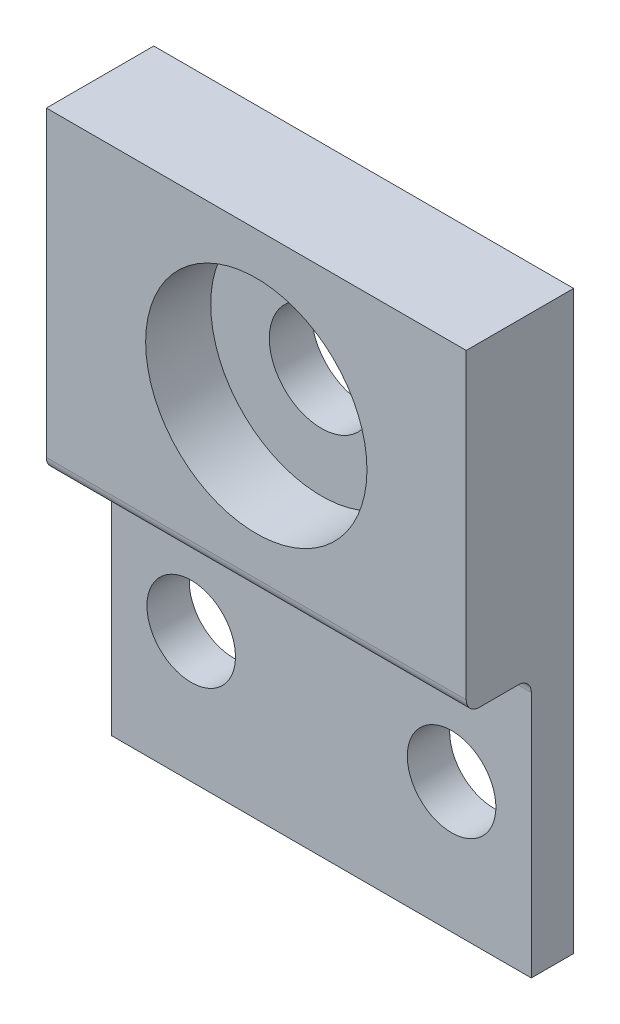
ISO-10303-21;
HEADER;
FILE_DESCRIPTION(('STEP AP214'),'2;1');
FILE_NAME('part.step','',(''),(''),'','','');
FILE_SCHEMA(('AUTOMOTIVE_DESIGN { 1 0 10303 214 1 1 1 1 }'));
ENDSEC;
DATA;
#1=APPLICATION_CONTEXT('core data for automotive mechanical design processes');
#2=APPLICATION_PROTOCOL_DEFINITION('international standard','automotive_design',2000,#1);
#3=PRODUCT_CONTEXT('',#1,'mechanical');
#4=PRODUCT('Part','Part','',(#3));
#5=PRODUCT_RELATED_PRODUCT_CATEGORY('part','',(#4));
#6=PRODUCT_DEFINITION_FORMATION('','',#4);
#7=PRODUCT_DEFINITION_CONTEXT('part definition',#1,'design');
#8=PRODUCT_DEFINITION('design','',#6,#7);
#9=PRODUCT_DEFINITION_SHAPE('','',#8);
#10=(LENGTH_UNIT() NAMED_UNIT(*) SI_UNIT(.MILLI.,.METRE.));
#11=(NAMED_UNIT(*) PLANE_ANGLE_UNIT() SI_UNIT($,.RADIAN.));
#12=(NAMED_UNIT(*) SI_UNIT($,.STERADIAN.) SOLID_ANGLE_UNIT());
#13=UNCERTAINTY_MEASURE_WITH_UNIT(LENGTH_MEASURE(1.E-05),#10,'distance_accuracy_value','');
#14=(GEOMETRIC_REPRESENTATION_CONTEXT(3) GLOBAL_UNCERTAINTY_ASSIGNED_CONTEXT((#13)) GLOBAL_UNIT_ASSIGNED_CONTEXT((#10,
#11,#12)) REPRESENTATION_CONTEXT('',''));
#15=CARTESIAN_POINT('',(0.,0.,0.));
#16=DIRECTION('',(0.,0.,1.));
#17=DIRECTION('',(1.,0.,0.));
#18=AXIS2_PLACEMENT_3D('',#15,#16,#17);
#19=CARTESIAN_POINT('',(0.,0.,3.25));
#20=DIRECTION('',(0.,0.,1.));
#21=DIRECTION('',(1.,0.,0.));
#22=AXIS2_PLACEMENT_3D('',#19,#20,#21);
#23=PLANE('',#22);
#24=CARTESIAN_POINT('',(26.125,10.,3.25));
#25=DIRECTION('',(0.,0.,1.));
#26=DIRECTION('',(1.,0.,0.));
#27=AXIS2_PLACEMENT_3D('',#24,#25,#26);
#28=CIRCLE('',#27,3.40036762718386);
#29=CARTESIAN_POINT('',(22.7246323728161,10.,3.25));
#30=VERTEX_POINT('',#29);
#31=EDGE_CURVE('E139',#30,#30,#28,.T.);
#32=ORIENTED_EDGE('',*,*,#31,.F.);
#33=EDGE_LOOP('',(#32));
#34=FACE_BOUND('',#33,.T.);
#35=CARTESIAN_POINT('',(6.125,10.,3.25));
#36=DIRECTION('',(0.,0.,1.));
#37=DIRECTION('',(1.,0.,0.));
#38=AXIS2_PLACEMENT_3D('',#35,#36,#37);
#39=CIRCLE('',#38,3.40036762718386);
#40=CARTESIAN_POINT('',(2.72463237281614,10.,3.25));
#41=VERTEX_POINT('',#40);
#42=EDGE_CURVE('E142',#41,#41,#39,.T.);
#43=ORIENTED_EDGE('',*,*,#42,.F.);
#44=EDGE_LOOP('',(#43));
#45=FACE_BOUND('',#44,.T.);
#46=DIRECTION('',(0.,1.,0.));
#47=VECTOR('',#46,1.);
#48=CARTESIAN_POINT('',(32.25,0.,3.25));
#49=LINE('',#48,#47);
#50=CARTESIAN_POINT('',(32.25,0.,3.25));
#51=VERTEX_POINT('',#50);
#52=CARTESIAN_POINT('',(32.25,19.,3.25));
#53=VERTEX_POINT('',#52);
#54=EDGE_CURVE('E149',#51,#53,#49,.T.);
#55=ORIENTED_EDGE('',*,*,#54,.T.);
#56=DIRECTION('',(-1.,0.,0.));
#57=VECTOR('',#56,1.);
#58=CARTESIAN_POINT('',(0.,19.,3.25));
#59=LINE('',#58,#57);
#60=CARTESIAN_POINT('',(0.,19.,3.25));
#61=VERTEX_POINT('',#60);
#62=EDGE_CURVE('E185',#53,#61,#59,.T.);
#63=ORIENTED_EDGE('',*,*,#62,.T.);
#64=DIRECTION('',(0.,1.,0.));
#65=VECTOR('',#64,1.);
#66=CARTESIAN_POINT('',(0.,0.,3.25));
#67=LINE('',#66,#65);
#68=CARTESIAN_POINT('',(0.,0.,3.25));
#69=VERTEX_POINT('',#68);
#70=EDGE_CURVE('E152',#69,#61,#67,.T.);
#71=ORIENTED_EDGE('',*,*,#70,.F.);
#72=DIRECTION('',(1.,0.,0.));
#73=VECTOR('',#72,1.);
#74=CARTESIAN_POINT('',(0.,0.,3.25));
#75=LINE('',#74,#73);
#76=EDGE_CURVE('E146',#69,#51,#75,.T.);
#77=ORIENTED_EDGE('',*,*,#76,.T.);
#78=EDGE_LOOP('',(#55,#63,#71,#77));
#79=FACE_BOUND('',#78,.T.);
#80=ADVANCED_FACE('F35',(#34,#45,#79),#23,.T.);
#81=CARTESIAN_POINT('',(0.,0.,3.25));
#82=DIRECTION('',(0.,1.,0.));
#83=DIRECTION('',(-1.,0.,0.));
#84=AXIS2_PLACEMENT_3D('',#81,#82,#83);
#85=PLANE('',#84);
#86=DIRECTION('',(1.,0.,0.));
#87=VECTOR('',#86,1.);
#88=CARTESIAN_POINT('',(0.,0.,0.));
#89=LINE('',#88,#87);
#90=CARTESIAN_POINT('',(0.,0.,0.));
#91=VERTEX_POINT('',#90);
#92=CARTESIAN_POINT('',(32.25,0.,0.));
#93=VERTEX_POINT('',#92);
#94=EDGE_CURVE('E163',#91,#93,#89,.T.);
#95=ORIENTED_EDGE('',*,*,#94,.T.);
#96=DIRECTION('',(0.,0.,-1.));
#97=VECTOR('',#96,1.);
#98=CARTESIAN_POINT('',(32.25,0.,3.25));
#99=LINE('',#98,#97);
#100=EDGE_CURVE('E119',#51,#93,#99,.T.);
#101=ORIENTED_EDGE('',*,*,#100,.F.);
#102=ORIENTED_EDGE('',*,*,#76,.F.);
#103=DIRECTION('',(0.,0.,-1.));
#104=VECTOR('',#103,1.);
#105=CARTESIAN_POINT('',(0.,0.,3.25));
#106=LINE('',#105,#104);
#107=EDGE_CURVE('E157',#69,#91,#106,.T.);
#108=ORIENTED_EDGE('',*,*,#107,.T.);
#109=EDGE_LOOP('',(#95,#101,#102,#108));
#110=FACE_BOUND('',#109,.T.);
#111=ADVANCED_FACE('F195',(#110),#85,.F.);
#112=CARTESIAN_POINT('',(32.25,0.,3.25));
#113=DIRECTION('',(-1.,0.,0.));
#114=DIRECTION('',(0.,0.,1.));
#115=AXIS2_PLACEMENT_3D('',#112,#113,#114);
#116=PLANE('',#115);
#117=DIRECTION('',(0.,1.,0.));
#118=VECTOR('',#117,1.);
#119=CARTESIAN_POINT('',(32.25,0.,8.25));
#120=LINE('',#119,#118);
#121=CARTESIAN_POINT('',(32.25,21.,8.25));
#122=VERTEX_POINT('',#121);
#123=CARTESIAN_POINT('',(32.25,44.25,8.25));
#124=VERTEX_POINT('',#123);
#125=EDGE_CURVE('E100',#122,#124,#120,.T.);
#126=ORIENTED_EDGE('',*,*,#125,.F.);
#127=CARTESIAN_POINT('',(32.25,21.,7.25));
#128=DIRECTION('',(-1.,0.,0.));
#129=DIRECTION('',(0.,0.,1.));
#130=AXIS2_PLACEMENT_3D('',#127,#128,#129);
#131=CIRCLE('',#130,1.);
#132=CARTESIAN_POINT('',(32.25,20.,7.25));
#133=VERTEX_POINT('',#132);
#134=EDGE_CURVE('E177',#122,#133,#131,.F.);
#135=ORIENTED_EDGE('',*,*,#134,.T.);
#136=DIRECTION('',(0.,0.,-1.));
#137=VECTOR('',#136,1.);
#138=CARTESIAN_POINT('',(32.25,20.,8.25));
#139=LINE('',#138,#137);
#140=CARTESIAN_POINT('',(32.25,20.,4.25));
#141=VERTEX_POINT('',#140);
#142=EDGE_CURVE('E132',#133,#141,#139,.T.);
#143=ORIENTED_EDGE('',*,*,#142,.T.);
#144=CARTESIAN_POINT('',(32.25,19.,4.25));
#145=DIRECTION('',(-1.,0.,0.));
#146=DIRECTION('',(0.,0.,1.));
#147=AXIS2_PLACEMENT_3D('',#144,#145,#146);
#148=CIRCLE('',#147,1.);
#149=EDGE_CURVE('E11',#141,#53,#148,.T.);
#150=ORIENTED_EDGE('',*,*,#149,.T.);
#151=ORIENTED_EDGE('',*,*,#54,.F.);
#152=ORIENTED_EDGE('',*,*,#100,.T.);
#153=DIRECTION('',(0.,1.,0.));
#154=VECTOR('',#153,1.);
#155=CARTESIAN_POINT('',(32.25,0.,0.));
#156=LINE('',#155,#154);
#157=CARTESIAN_POINT('',(32.25,44.25,0.));
#158=VERTEX_POINT('',#157);
#159=EDGE_CURVE('E115',#93,#158,#156,.T.);
#160=ORIENTED_EDGE('',*,*,#159,.T.);
#161=DIRECTION('',(0.,0.,-1.));
#162=VECTOR('',#161,1.);
#163=CARTESIAN_POINT('',(32.25,44.25,3.25));
#164=LINE('',#163,#162);
#165=EDGE_CURVE('E112',#124,#158,#164,.T.);
#166=ORIENTED_EDGE('',*,*,#165,.F.);
#167=EDGE_LOOP('',(#126,#135,#143,#150,#151,#152,#160,#166));
#168=FACE_BOUND('',#167,.T.);
#169=ADVANCED_FACE('F113',(#168),#116,.F.);
#170=CARTESIAN_POINT('',(0.,44.25,3.25));
#171=DIRECTION('',(0.,1.,0.));
#172=DIRECTION('',(0.,0.,1.));
#173=AXIS2_PLACEMENT_3D('',#170,#171,#172);
#174=PLANE('',#173);
#175=DIRECTION('',(1.,0.,0.));
#176=VECTOR('',#175,1.);
#177=CARTESIAN_POINT('',(0.,44.25,0.));
#178=LINE('',#177,#176);
#179=CARTESIAN_POINT('',(0.,44.25,0.));
#180=VERTEX_POINT('',#179);
#181=EDGE_CURVE('E167',#180,#158,#178,.T.);
#182=ORIENTED_EDGE('',*,*,#181,.F.);
#183=DIRECTION('',(0.,0.,-1.));
#184=VECTOR('',#183,1.);
#185=CARTESIAN_POINT('',(0.,44.25,3.25));
#186=LINE('',#185,#184);
#187=CARTESIAN_POINT('',(0.,44.25,8.25));
#188=VERTEX_POINT('',#187);
#189=EDGE_CURVE('E120',#188,#180,#186,.T.);
#190=ORIENTED_EDGE('',*,*,#189,.F.);
#191=DIRECTION('',(1.,0.,0.));
#192=VECTOR('',#191,1.);
#193=CARTESIAN_POINT('',(0.,44.25,8.25));
#194=LINE('',#193,#192);
#195=EDGE_CURVE('E105',#188,#124,#194,.T.);
#196=ORIENTED_EDGE('',*,*,#195,.T.);
#197=ORIENTED_EDGE('',*,*,#165,.T.);
#198=EDGE_LOOP('',(#182,#190,#196,#197));
#199=FACE_BOUND('',#198,.T.);
#200=ADVANCED_FACE('F123',(#199),#174,.T.);
#201=CARTESIAN_POINT('',(0.,0.,3.25));
#202=DIRECTION('',(-1.,0.,0.));
#203=DIRECTION('',(0.,0.,1.));
#204=AXIS2_PLACEMENT_3D('',#201,#202,#203);
#205=PLANE('',#204);
#206=DIRECTION('',(0.,0.,-1.));
#207=VECTOR('',#206,1.);
#208=CARTESIAN_POINT('',(0.,20.,8.25));
#209=LINE('',#208,#207);
#210=CARTESIAN_POINT('',(0.,20.,7.25));
#211=VERTEX_POINT('',#210);
#212=CARTESIAN_POINT('',(0.,20.,4.25));
#213=VERTEX_POINT('',#212);
#214=EDGE_CURVE('E127',#211,#213,#209,.T.);
#215=ORIENTED_EDGE('',*,*,#214,.F.);
#216=CARTESIAN_POINT('',(0.,21.,7.25));
#217=DIRECTION('',(-1.,0.,0.));
#218=DIRECTION('',(0.,0.,1.));
#219=AXIS2_PLACEMENT_3D('',#216,#217,#218);
#220=CIRCLE('',#219,1.);
#221=CARTESIAN_POINT('',(0.,21.,8.25));
#222=VERTEX_POINT('',#221);
#223=EDGE_CURVE('E183',#211,#222,#220,.T.);
#224=ORIENTED_EDGE('',*,*,#223,.T.);
#225=DIRECTION('',(0.,1.,0.));
#226=VECTOR('',#225,1.);
#227=CARTESIAN_POINT('',(0.,0.,8.25));
#228=LINE('',#227,#226);
#229=EDGE_CURVE('E125',#222,#188,#228,.T.);
#230=ORIENTED_EDGE('',*,*,#229,.T.);
#231=ORIENTED_EDGE('',*,*,#189,.T.);
#232=DIRECTION('',(0.,1.,0.));
#233=VECTOR('',#232,1.);
#234=CARTESIAN_POINT('',(0.,0.,0.));
#235=LINE('',#234,#233);
#236=EDGE_CURVE('E169',#91,#180,#235,.T.);
#237=ORIENTED_EDGE('',*,*,#236,.F.);
#238=ORIENTED_EDGE('',*,*,#107,.F.);
#239=ORIENTED_EDGE('',*,*,#70,.T.);
#240=CARTESIAN_POINT('',(0.,19.,4.25));
#241=DIRECTION('',(-1.,0.,0.));
#242=DIRECTION('',(0.,0.,1.));
#243=AXIS2_PLACEMENT_3D('',#240,#241,#242);
#244=CIRCLE('',#243,1.);
#245=EDGE_CURVE('E43',#61,#213,#244,.F.);
#246=ORIENTED_EDGE('',*,*,#245,.T.);
#247=EDGE_LOOP('',(#215,#224,#230,#231,#237,#238,#239,#246));
#248=FACE_BOUND('',#247,.T.);
#249=ADVANCED_FACE('F189',(#248),#205,.T.);
#250=CARTESIAN_POINT('',(6.125,10.,3.25));
#251=DIRECTION('',(0.,0.,-1.));
#252=DIRECTION('',(-1.,0.,0.));
#253=AXIS2_PLACEMENT_3D('',#250,#251,#252);
#254=CYLINDRICAL_SURFACE('',#253,3.40036762718386);
#255=CARTESIAN_POINT('',(6.125,10.,0.));
#256=DIRECTION('',(0.,0.,1.));
#257=DIRECTION('',(1.,0.,0.));
#258=AXIS2_PLACEMENT_3D('',#255,#256,#257);
#259=CIRCLE('',#258,3.40036762718386);
#260=CARTESIAN_POINT('',(2.72463237281614,10.,0.));
#261=VERTEX_POINT('',#260);
#262=EDGE_CURVE('E160',#261,#261,#259,.T.);
#263=CARTESIAN_POINT('',(2.72463237281614,10.,3.25));
#264=CARTESIAN_POINT('',(2.72463237281614,10.,3.21614583333333));
#265=CARTESIAN_POINT('',(2.72463237281614,10.,3.18229166666667));
#266=CARTESIAN_POINT('',(2.72463237281614,10.,3.11458333333333));
#267=CARTESIAN_POINT('',(2.72463237281614,10.,3.08072916666667));
#268=CARTESIAN_POINT('',(2.72463237281614,10.,3.01302083333333));
#269=CARTESIAN_POINT('',(2.72463237281614,10.,2.97916666666667));
#270=CARTESIAN_POINT('',(2.72463237281614,10.,2.91145833333333));
#271=CARTESIAN_POINT('',(2.72463237281614,10.,2.87760416666667));
#272=CARTESIAN_POINT('',(2.72463237281614,10.,2.80989583333333));
#273=CARTESIAN_POINT('',(2.72463237281614,10.,2.77604166666667));
#274=CARTESIAN_POINT('',(2.72463237281614,10.,2.70833333333333));
#275=CARTESIAN_POINT('',(2.72463237281614,10.,2.67447916666667));
#276=CARTESIAN_POINT('',(2.72463237281614,10.,2.60677083333333));
#277=CARTESIAN_POINT('',(2.72463237281614,10.,2.57291666666667));
#278=CARTESIAN_POINT('',(2.72463237281614,10.,2.50520833333333));
#279=CARTESIAN_POINT('',(2.72463237281614,10.,2.47135416666667));
#280=CARTESIAN_POINT('',(2.72463237281614,10.,2.40364583333333));
#281=CARTESIAN_POINT('',(2.72463237281614,10.,2.36979166666667));
#282=CARTESIAN_POINT('',(2.72463237281614,10.,2.30208333333333));
#283=CARTESIAN_POINT('',(2.72463237281614,10.,2.26822916666667));
#284=CARTESIAN_POINT('',(2.72463237281614,10.,2.20052083333333));
#285=CARTESIAN_POINT('',(2.72463237281614,10.,2.16666666666667));
#286=CARTESIAN_POINT('',(2.72463237281614,10.,2.09895833333333));
#287=CARTESIAN_POINT('',(2.72463237281614,10.,2.06510416666667));
#288=CARTESIAN_POINT('',(2.72463237281614,10.,1.99739583333333));
#289=CARTESIAN_POINT('',(2.72463237281614,10.,1.96354166666667));
#290=CARTESIAN_POINT('',(2.72463237281614,10.,1.89583333333333));
#291=CARTESIAN_POINT('',(2.72463237281614,10.,1.86197916666667));
#292=CARTESIAN_POINT('',(2.72463237281614,10.,1.79427083333333));
#293=CARTESIAN_POINT('',(2.72463237281614,10.,1.76041666666667));
#294=CARTESIAN_POINT('',(2.72463237281614,10.,1.69270833333333));
#295=CARTESIAN_POINT('',(2.72463237281614,10.,1.65885416666667));
#296=CARTESIAN_POINT('',(2.72463237281614,10.,1.59114583333333));
#297=CARTESIAN_POINT('',(2.72463237281614,10.,1.55729166666667));
#298=CARTESIAN_POINT('',(2.72463237281614,10.,1.48958333333333));
#299=CARTESIAN_POINT('',(2.72463237281614,10.,1.45572916666667));
#300=CARTESIAN_POINT('',(2.72463237281614,10.,1.38802083333333));
#301=CARTESIAN_POINT('',(2.72463237281614,10.,1.35416666666667));
#302=CARTESIAN_POINT('',(2.72463237281614,10.,1.28645833333333));
#303=CARTESIAN_POINT('',(2.72463237281614,10.,1.25260416666667));
#304=CARTESIAN_POINT('',(2.72463237281614,10.,1.18489583333333));
#305=CARTESIAN_POINT('',(2.72463237281614,10.,1.15104166666667));
#306=CARTESIAN_POINT('',(2.72463237281614,10.,1.08333333333333));
#307=CARTESIAN_POINT('',(2.72463237281614,10.,1.04947916666667));
#308=CARTESIAN_POINT('',(2.72463237281614,10.,0.981770833333333));
#309=CARTESIAN_POINT('',(2.72463237281614,10.,0.947916666666667));
#310=CARTESIAN_POINT('',(2.72463237281614,10.,0.880208333333333));
#311=CARTESIAN_POINT('',(2.72463237281614,10.,0.846354166666667));
#312=CARTESIAN_POINT('',(2.72463237281614,10.,0.778645833333333));
#313=CARTESIAN_POINT('',(2.72463237281614,10.,0.744791666666667));
#314=CARTESIAN_POINT('',(2.72463237281614,10.,0.677083333333333));
#315=CARTESIAN_POINT('',(2.72463237281614,10.,0.643229166666667));
#316=CARTESIAN_POINT('',(2.72463237281614,10.,0.575520833333333));
#317=CARTESIAN_POINT('',(2.72463237281614,10.,0.541666666666667));
#318=CARTESIAN_POINT('',(2.72463237281614,10.,0.473958333333333));
#319=CARTESIAN_POINT('',(2.72463237281614,10.,0.440104166666667));
#320=CARTESIAN_POINT('',(2.72463237281614,10.,0.372395833333333));
#321=CARTESIAN_POINT('',(2.72463237281614,10.,0.338541666666667));
#322=CARTESIAN_POINT('',(2.72463237281614,10.,0.270833333333333));
#323=CARTESIAN_POINT('',(2.72463237281614,10.,0.236979166666667));
#324=CARTESIAN_POINT('',(2.72463237281614,10.,0.169270833333333));
#325=CARTESIAN_POINT('',(2.72463237281614,10.,0.135416666666667));
#326=CARTESIAN_POINT('',(2.72463237281614,10.,0.0677083333333334));
#327=CARTESIAN_POINT('',(2.72463237281614,10.,0.0338541666666667));
#328=CARTESIAN_POINT('',(2.72463237281614,10.,0.));
#329=B_SPLINE_CURVE_WITH_KNOTS('',3,(#263,#264,#265,#266,#267,#268,#269,#270,#271,#272,#273,
#274,#275,#276,#277,#278,#279,#280,#281,#282,#283,#284,#285,#286,#287,#288,#289,#290,#291,#292,
#293,#294,#295,#296,#297,#298,#299,#300,#301,#302,#303,#304,#305,#306,#307,#308,#309,#310,#311,
#312,#313,#314,#315,#316,#317,#318,#319,#320,#321,#322,#323,#324,#325,#326,#327,#328),
.UNSPECIFIED.,.F.,.F.,(4,2,2,2,2,2,2,2,2,2,2,2,2,2,2,2,2,2,2,2,2,2,2,2,2,2,2,2,2,2,2,2,4),(0.,
0.1015625,0.203125,0.3046875,0.40625,0.5078125,0.609375,0.7109375,0.8125,0.9140625,1.015625,
1.1171875,1.21875,1.3203125,1.421875,1.5234375,1.625,1.7265625,1.828125,1.9296875,2.03125,
2.1328125,2.234375,2.3359375,2.4375,2.5390625,2.640625,2.7421875,2.84375,2.9453125,3.046875,
3.1484375,3.25),.UNSPECIFIED.);
#330=EDGE_CURVE('BSEAM247',#41,#261,#329,.T.);
#331=ORIENTED_EDGE('',*,*,#42,.T.);
#332=ORIENTED_EDGE('',*,*,#262,.F.);
#333=ORIENTED_EDGE('',*,*,#330,.T.);
#334=ORIENTED_EDGE('',*,*,#330,.F.);
#335=EDGE_LOOP('',(#331,#333,#332,#334));
#336=FACE_BOUND('',#335,.T.);
#337=ADVANCED_FACE('F247',(#336),#254,.F.);
#338=CARTESIAN_POINT('',(26.125,10.,3.25));
#339=DIRECTION('',(0.,0.,-1.));
#340=DIRECTION('',(-1.,0.,0.));
#341=AXIS2_PLACEMENT_3D('',#338,#339,#340);
#342=CYLINDRICAL_SURFACE('',#341,3.40036762718386);
#343=CARTESIAN_POINT('',(26.125,10.,0.));
#344=DIRECTION('',(0.,0.,1.));
#345=DIRECTION('',(1.,0.,0.));
#346=AXIS2_PLACEMENT_3D('',#343,#344,#345);
#347=CIRCLE('',#346,3.40036762718386);
#348=CARTESIAN_POINT('',(22.7246323728161,10.,0.));
#349=VERTEX_POINT('',#348);
#350=EDGE_CURVE('E135',#349,#349,#347,.T.);
#351=CARTESIAN_POINT('',(22.7246323728161,10.,3.25));
#352=CARTESIAN_POINT('',(22.7246323728161,10.,3.21614583333333));
#353=CARTESIAN_POINT('',(22.7246323728161,10.,3.18229166666667));
#354=CARTESIAN_POINT('',(22.7246323728161,10.,3.11458333333333));
#355=CARTESIAN_POINT('',(22.7246323728161,10.,3.08072916666667));
#356=CARTESIAN_POINT('',(22.7246323728161,10.,3.01302083333333));
#357=CARTESIAN_POINT('',(22.7246323728161,10.,2.97916666666667));
#358=CARTESIAN_POINT('',(22.7246323728161,10.,2.91145833333333));
#359=CARTESIAN_POINT('',(22.7246323728161,10.,2.87760416666667));
#360=CARTESIAN_POINT('',(22.7246323728161,10.,2.80989583333333));
#361=CARTESIAN_POINT('',(22.7246323728161,10.,2.77604166666667));
#362=CARTESIAN_POINT('',(22.7246323728161,10.,2.70833333333333));
#363=CARTESIAN_POINT('',(22.7246323728161,10.,2.67447916666667));
#364=CARTESIAN_POINT('',(22.7246323728161,10.,2.60677083333333));
#365=CARTESIAN_POINT('',(22.7246323728161,10.,2.57291666666667));
#366=CARTESIAN_POINT('',(22.7246323728161,10.,2.50520833333333));
#367=CARTESIAN_POINT('',(22.7246323728161,10.,2.47135416666667));
#368=CARTESIAN_POINT('',(22.7246323728161,10.,2.40364583333333));
#369=CARTESIAN_POINT('',(22.7246323728161,10.,2.36979166666667));
#370=CARTESIAN_POINT('',(22.7246323728161,10.,2.30208333333333));
#371=CARTESIAN_POINT('',(22.7246323728161,10.,2.26822916666667));
#372=CARTESIAN_POINT('',(22.7246323728161,10.,2.20052083333333));
#373=CARTESIAN_POINT('',(22.7246323728161,10.,2.16666666666667));
#374=CARTESIAN_POINT('',(22.7246323728161,10.,2.09895833333333));
#375=CARTESIAN_POINT('',(22.7246323728161,10.,2.06510416666667));
#376=CARTESIAN_POINT('',(22.7246323728161,10.,1.99739583333333));
#377=CARTESIAN_POINT('',(22.7246323728161,10.,1.96354166666667));
#378=CARTESIAN_POINT('',(22.7246323728161,10.,1.89583333333333));
#379=CARTESIAN_POINT('',(22.7246323728161,10.,1.86197916666667));
#380=CARTESIAN_POINT('',(22.7246323728161,10.,1.79427083333333));
#381=CARTESIAN_POINT('',(22.7246323728161,10.,1.76041666666667));
#382=CARTESIAN_POINT('',(22.7246323728161,10.,1.69270833333333));
#383=CARTESIAN_POINT('',(22.7246323728161,10.,1.65885416666667));
#384=CARTESIAN_POINT('',(22.7246323728161,10.,1.59114583333333));
#385=CARTESIAN_POINT('',(22.7246323728161,10.,1.55729166666667));
#386=CARTESIAN_POINT('',(22.7246323728161,10.,1.48958333333333));
#387=CARTESIAN_POINT('',(22.7246323728161,10.,1.45572916666667));
#388=CARTESIAN_POINT('',(22.7246323728161,10.,1.38802083333333));
#389=CARTESIAN_POINT('',(22.7246323728161,10.,1.35416666666667));
#390=CARTESIAN_POINT('',(22.7246323728161,10.,1.28645833333333));
#391=CARTESIAN_POINT('',(22.7246323728161,10.,1.25260416666667));
#392=CARTESIAN_POINT('',(22.7246323728161,10.,1.18489583333333));
#393=CARTESIAN_POINT('',(22.7246323728161,10.,1.15104166666667));
#394=CARTESIAN_POINT('',(22.7246323728161,10.,1.08333333333333));
#395=CARTESIAN_POINT('',(22.7246323728161,10.,1.04947916666667));
#396=CARTESIAN_POINT('',(22.7246323728161,10.,0.981770833333333));
#397=CARTESIAN_POINT('',(22.7246323728161,10.,0.947916666666667));
#398=CARTESIAN_POINT('',(22.7246323728161,10.,0.880208333333333));
#399=CARTESIAN_POINT('',(22.7246323728161,10.,0.846354166666667));
#400=CARTESIAN_POINT('',(22.7246323728161,10.,0.778645833333333));
#401=CARTESIAN_POINT('',(22.7246323728161,10.,0.744791666666667));
#402=CARTESIAN_POINT('',(22.7246323728161,10.,0.677083333333333));
#403=CARTESIAN_POINT('',(22.7246323728161,10.,0.643229166666667));
#404=CARTESIAN_POINT('',(22.7246323728161,10.,0.575520833333333));
#405=CARTESIAN_POINT('',(22.7246323728161,10.,0.541666666666667));
#406=CARTESIAN_POINT('',(22.7246323728161,10.,0.473958333333333));
#407=CARTESIAN_POINT('',(22.7246323728161,10.,0.440104166666667));
#408=CARTESIAN_POINT('',(22.7246323728161,10.,0.372395833333333));
#409=CARTESIAN_POINT('',(22.7246323728161,10.,0.338541666666667));
#410=CARTESIAN_POINT('',(22.7246323728161,10.,0.270833333333333));
#411=CARTESIAN_POINT('',(22.7246323728161,10.,0.236979166666667));
#412=CARTESIAN_POINT('',(22.7246323728161,10.,0.169270833333333));
#413=CARTESIAN_POINT('',(22.7246323728161,10.,0.135416666666667));
#414=CARTESIAN_POINT('',(22.7246323728161,10.,0.0677083333333334));
#415=CARTESIAN_POINT('',(22.7246323728161,10.,0.0338541666666667));
#416=CARTESIAN_POINT('',(22.7246323728161,10.,0.));
#417=B_SPLINE_CURVE_WITH_KNOTS('',3,(#351,#352,#353,#354,#355,#356,#357,#358,#359,#360,#361,
#362,#363,#364,#365,#366,#367,#368,#369,#370,#371,#372,#373,#374,#375,#376,#377,#378,#379,#380,
#381,#382,#383,#384,#385,#386,#387,#388,#389,#390,#391,#392,#393,#394,#395,#396,#397,#398,#399,
#400,#401,#402,#403,#404,#405,#406,#407,#408,#409,#410,#411,#412,#413,#414,#415,#416),
.UNSPECIFIED.,.F.,.F.,(4,2,2,2,2,2,2,2,2,2,2,2,2,2,2,2,2,2,2,2,2,2,2,2,2,2,2,2,2,2,2,2,4),(0.,
0.1015625,0.203125,0.3046875,0.40625,0.5078125,0.609375,0.7109375,0.8125,0.9140625,1.015625,
1.1171875,1.21875,1.3203125,1.421875,1.5234375,1.625,1.7265625,1.828125,1.9296875,2.03125,
2.1328125,2.234375,2.3359375,2.4375,2.5390625,2.640625,2.7421875,2.84375,2.9453125,3.046875,
3.1484375,3.25),.UNSPECIFIED.);
#418=EDGE_CURVE('BSEAM233',#30,#349,#417,.T.);
#419=ORIENTED_EDGE('',*,*,#31,.T.);
#420=ORIENTED_EDGE('',*,*,#350,.F.);
#421=ORIENTED_EDGE('',*,*,#418,.T.);
#422=ORIENTED_EDGE('',*,*,#418,.F.);
#423=EDGE_LOOP('',(#419,#421,#420,#422));
#424=FACE_BOUND('',#423,.T.);
#425=ADVANCED_FACE('F233',(#424),#342,.F.);
#426=CARTESIAN_POINT('',(16.125,32.5,3.25));
#427=DIRECTION('',(0.,0.,-1.));
#428=DIRECTION('',(-1.,0.,0.));
#429=AXIS2_PLACEMENT_3D('',#426,#427,#428);
#430=CYLINDRICAL_SURFACE('',#429,4.);
#431=CARTESIAN_POINT('',(16.125,32.5,3.25));
#432=DIRECTION('',(0.,0.,1.));
#433=DIRECTION('',(1.,0.,0.));
#434=AXIS2_PLACEMENT_3D('',#431,#432,#433);
#435=CIRCLE('',#434,4.);
#436=CARTESIAN_POINT('',(12.125,32.5,3.25));
#437=VERTEX_POINT('',#436);
#438=EDGE_CURVE('E154',#437,#437,#435,.T.);
#439=CARTESIAN_POINT('',(16.125,32.5,0.));
#440=DIRECTION('',(0.,0.,1.));
#441=DIRECTION('',(1.,0.,0.));
#442=AXIS2_PLACEMENT_3D('',#439,#440,#441);
#443=CIRCLE('',#442,4.);
#444=CARTESIAN_POINT('',(12.125,32.5,0.));
#445=VERTEX_POINT('',#444);
#446=EDGE_CURVE('E143',#445,#445,#443,.T.);
#447=CARTESIAN_POINT('',(12.125,32.5,3.25));
#448=CARTESIAN_POINT('',(12.125,32.5,3.21614583333333));
#449=CARTESIAN_POINT('',(12.125,32.5,3.18229166666667));
#450=CARTESIAN_POINT('',(12.125,32.5,3.11458333333333));
#451=CARTESIAN_POINT('',(12.125,32.5,3.08072916666667));
#452=CARTESIAN_POINT('',(12.125,32.5,3.01302083333333));
#453=CARTESIAN_POINT('',(12.125,32.5,2.97916666666667));
#454=CARTESIAN_POINT('',(12.125,32.5,2.91145833333333));
#455=CARTESIAN_POINT('',(12.125,32.5,2.87760416666667));
#456=CARTESIAN_POINT('',(12.125,32.5,2.80989583333333));
#457=CARTESIAN_POINT('',(12.125,32.5,2.77604166666667));
#458=CARTESIAN_POINT('',(12.125,32.5,2.70833333333333));
#459=CARTESIAN_POINT('',(12.125,32.5,2.67447916666667));
#460=CARTESIAN_POINT('',(12.125,32.5,2.60677083333333));
#461=CARTESIAN_POINT('',(12.125,32.5,2.57291666666667));
#462=CARTESIAN_POINT('',(12.125,32.5,2.50520833333333));
#463=CARTESIAN_POINT('',(12.125,32.5,2.47135416666667));
#464=CARTESIAN_POINT('',(12.125,32.5,2.40364583333333));
#465=CARTESIAN_POINT('',(12.125,32.5,2.36979166666667));
#466=CARTESIAN_POINT('',(12.125,32.5,2.30208333333333));
#467=CARTESIAN_POINT('',(12.125,32.5,2.26822916666667));
#468=CARTESIAN_POINT('',(12.125,32.5,2.20052083333333));
#469=CARTESIAN_POINT('',(12.125,32.5,2.16666666666667));
#470=CARTESIAN_POINT('',(12.125,32.5,2.09895833333333));
#471=CARTESIAN_POINT('',(12.125,32.5,2.06510416666667));
#472=CARTESIAN_POINT('',(12.125,32.5,1.99739583333333));
#473=CARTESIAN_POINT('',(12.125,32.5,1.96354166666667));
#474=CARTESIAN_POINT('',(12.125,32.5,1.89583333333333));
#475=CARTESIAN_POINT('',(12.125,32.5,1.86197916666667));
#476=CARTESIAN_POINT('',(12.125,32.5,1.79427083333333));
#477=CARTESIAN_POINT('',(12.125,32.5,1.76041666666667));
#478=CARTESIAN_POINT('',(12.125,32.5,1.69270833333333));
#479=CARTESIAN_POINT('',(12.125,32.5,1.65885416666667));
#480=CARTESIAN_POINT('',(12.125,32.5,1.59114583333333));
#481=CARTESIAN_POINT('',(12.125,32.5,1.55729166666667));
#482=CARTESIAN_POINT('',(12.125,32.5,1.48958333333333));
#483=CARTESIAN_POINT('',(12.125,32.5,1.45572916666667));
#484=CARTESIAN_POINT('',(12.125,32.5,1.38802083333333));
#485=CARTESIAN_POINT('',(12.125,32.5,1.35416666666667));
#486=CARTESIAN_POINT('',(12.125,32.5,1.28645833333333));
#487=CARTESIAN_POINT('',(12.125,32.5,1.25260416666667));
#488=CARTESIAN_POINT('',(12.125,32.5,1.18489583333333));
#489=CARTESIAN_POINT('',(12.125,32.5,1.15104166666667));
#490=CARTESIAN_POINT('',(12.125,32.5,1.08333333333333));
#491=CARTESIAN_POINT('',(12.125,32.5,1.04947916666667));
#492=CARTESIAN_POINT('',(12.125,32.5,0.981770833333333));
#493=CARTESIAN_POINT('',(12.125,32.5,0.947916666666667));
#494=CARTESIAN_POINT('',(12.125,32.5,0.880208333333333));
#495=CARTESIAN_POINT('',(12.125,32.5,0.846354166666667));
#496=CARTESIAN_POINT('',(12.125,32.5,0.778645833333333));
#497=CARTESIAN_POINT('',(12.125,32.5,0.744791666666667));
#498=CARTESIAN_POINT('',(12.125,32.5,0.677083333333333));
#499=CARTESIAN_POINT('',(12.125,32.5,0.643229166666667));
#500=CARTESIAN_POINT('',(12.125,32.5,0.575520833333333));
#501=CARTESIAN_POINT('',(12.125,32.5,0.541666666666667));
#502=CARTESIAN_POINT('',(12.125,32.5,0.473958333333333));
#503=CARTESIAN_POINT('',(12.125,32.5,0.440104166666667));
#504=CARTESIAN_POINT('',(12.125,32.5,0.372395833333333));
#505=CARTESIAN_POINT('',(12.125,32.5,0.338541666666667));
#506=CARTESIAN_POINT('',(12.125,32.5,0.270833333333333));
#507=CARTESIAN_POINT('',(12.125,32.5,0.236979166666667));
#508=CARTESIAN_POINT('',(12.125,32.5,0.169270833333333));
#509=CARTESIAN_POINT('',(12.125,32.5,0.135416666666667));
#510=CARTESIAN_POINT('',(12.125,32.5,0.0677083333333334));
#511=CARTESIAN_POINT('',(12.125,32.5,0.0338541666666667));
#512=CARTESIAN_POINT('',(12.125,32.5,0.));
#513=B_SPLINE_CURVE_WITH_KNOTS('',3,(#447,#448,#449,#450,#451,#452,#453,#454,#455,#456,#457,
#458,#459,#460,#461,#462,#463,#464,#465,#466,#467,#468,#469,#470,#471,#472,#473,#474,#475,#476,
#477,#478,#479,#480,#481,#482,#483,#484,#485,#486,#487,#488,#489,#490,#491,#492,#493,#494,#495,
#496,#497,#498,#499,#500,#501,#502,#503,#504,#505,#506,#507,#508,#509,#510,#511,#512),
.UNSPECIFIED.,.F.,.F.,(4,2,2,2,2,2,2,2,2,2,2,2,2,2,2,2,2,2,2,2,2,2,2,2,2,2,2,2,2,2,2,2,4),(0.,
0.1015625,0.203125,0.3046875,0.40625,0.5078125,0.609375,0.7109375,0.8125,0.9140625,1.015625,
1.1171875,1.21875,1.3203125,1.421875,1.5234375,1.625,1.7265625,1.828125,1.9296875,2.03125,
2.1328125,2.234375,2.3359375,2.4375,2.5390625,2.640625,2.7421875,2.84375,2.9453125,3.046875,
3.1484375,3.25),.UNSPECIFIED.);
#514=EDGE_CURVE('BSEAM226',#437,#445,#513,.T.);
#515=ORIENTED_EDGE('',*,*,#438,.T.);
#516=ORIENTED_EDGE('',*,*,#446,.F.);
#517=ORIENTED_EDGE('',*,*,#514,.T.);
#518=ORIENTED_EDGE('',*,*,#514,.F.);
#519=EDGE_LOOP('',(#515,#517,#516,#518));
#520=FACE_BOUND('',#519,.T.);
#521=ADVANCED_FACE('F226',(#520),#430,.F.);
#522=CARTESIAN_POINT('',(16.125,32.5,3.25));
#523=DIRECTION('',(0.,0.,1.));
#524=DIRECTION('',(1.,0.,0.));
#525=AXIS2_PLACEMENT_3D('',#522,#523,#524);
#526=CIRCLE('',#525,8.5);
#527=CARTESIAN_POINT('',(24.625,32.5,3.25));
#528=VERTEX_POINT('',#527);
#529=EDGE_CURVE('E136',#528,#528,#526,.F.);
#530=ORIENTED_EDGE('',*,*,#529,.F.);
#531=EDGE_LOOP('',(#530));
#532=FACE_BOUND('',#531,.T.);
#533=ORIENTED_EDGE('',*,*,#438,.F.);
#534=EDGE_LOOP('',(#533));
#535=FACE_BOUND('',#534,.T.);
#536=ADVANCED_FACE('F215',(#532,#535),#23,.T.);
#537=CARTESIAN_POINT('',(0.,0.,0.));
#538=DIRECTION('',(0.,0.,1.));
#539=DIRECTION('',(1.,0.,0.));
#540=AXIS2_PLACEMENT_3D('',#537,#538,#539);
#541=PLANE('',#540);
#542=ORIENTED_EDGE('',*,*,#446,.T.);
#543=EDGE_LOOP('',(#542));
#544=FACE_BOUND('',#543,.T.);
#545=ORIENTED_EDGE('',*,*,#181,.T.);
#546=ORIENTED_EDGE('',*,*,#159,.F.);
#547=ORIENTED_EDGE('',*,*,#94,.F.);
#548=ORIENTED_EDGE('',*,*,#236,.T.);
#549=EDGE_LOOP('',(#545,#546,#547,#548));
#550=FACE_BOUND('',#549,.T.);
#551=ORIENTED_EDGE('',*,*,#350,.T.);
#552=EDGE_LOOP('',(#551));
#553=FACE_BOUND('',#552,.T.);
#554=ORIENTED_EDGE('',*,*,#262,.T.);
#555=EDGE_LOOP('',(#554));
#556=FACE_BOUND('',#555,.T.);
#557=ADVANCED_FACE('F225',(#544,#550,#553,#556),#541,.F.);
#558=CARTESIAN_POINT('',(0.,20.,8.25));
#559=DIRECTION('',(0.,1.,0.));
#560=DIRECTION('',(0.,0.,1.));
#561=AXIS2_PLACEMENT_3D('',#558,#559,#560);
#562=PLANE('',#561);
#563=ORIENTED_EDGE('',*,*,#142,.F.);
#564=DIRECTION('',(1.,0.,0.));
#565=VECTOR('',#564,1.);
#566=CARTESIAN_POINT('',(0.,20.,7.25));
#567=LINE('',#566,#565);
#568=EDGE_CURVE('E181',#133,#211,#567,.F.);
#569=ORIENTED_EDGE('',*,*,#568,.T.);
#570=ORIENTED_EDGE('',*,*,#214,.T.);
#571=DIRECTION('',(-1.,0.,0.));
#572=VECTOR('',#571,1.);
#573=CARTESIAN_POINT('',(0.,20.,4.25));
#574=LINE('',#573,#572);
#575=EDGE_CURVE('E179',#213,#141,#574,.F.);
#576=ORIENTED_EDGE('',*,*,#575,.T.);
#577=EDGE_LOOP('',(#563,#569,#570,#576));
#578=FACE_BOUND('',#577,.T.);
#579=ADVANCED_FACE('F198',(#578),#562,.F.);
#580=CARTESIAN_POINT('',(16.125,32.5,8.25));
#581=DIRECTION('',(0.,0.,-1.));
#582=DIRECTION('',(-1.,0.,0.));
#583=AXIS2_PLACEMENT_3D('',#580,#581,#582);
#584=CYLINDRICAL_SURFACE('',#583,8.5);
#585=ORIENTED_EDGE('',*,*,#529,.T.);
#586=EDGE_LOOP('',(#585));
#587=FACE_BOUND('',#586,.T.);
#588=CARTESIAN_POINT('',(16.125,32.5,8.25));
#589=DIRECTION('',(0.,0.,1.));
#590=DIRECTION('',(1.,0.,0.));
#591=AXIS2_PLACEMENT_3D('',#588,#589,#590);
#592=CIRCLE('',#591,8.5);
#593=CARTESIAN_POINT('',(24.625,32.5,8.25));
#594=VERTEX_POINT('',#593);
#595=EDGE_CURVE('E109',#594,#594,#592,.T.);
#596=ORIENTED_EDGE('',*,*,#595,.T.);
#597=EDGE_LOOP('',(#596));
#598=FACE_BOUND('',#597,.T.);
#599=ADVANCED_FACE('F208',(#587,#598),#584,.F.);
#600=CARTESIAN_POINT('',(0.,0.,8.25));
#601=DIRECTION('',(0.,0.,1.));
#602=DIRECTION('',(1.,0.,0.));
#603=AXIS2_PLACEMENT_3D('',#600,#601,#602);
#604=PLANE('',#603);
#605=ORIENTED_EDGE('',*,*,#595,.F.);
#606=EDGE_LOOP('',(#605));
#607=FACE_BOUND('',#606,.T.);
#608=ORIENTED_EDGE('',*,*,#229,.F.);
#609=DIRECTION('',(1.,0.,0.));
#610=VECTOR('',#609,1.);
#611=CARTESIAN_POINT('',(32.25,21.,8.25));
#612=LINE('',#611,#610);
#613=EDGE_CURVE('E107',#222,#122,#612,.T.);
#614=ORIENTED_EDGE('',*,*,#613,.T.);
#615=ORIENTED_EDGE('',*,*,#125,.T.);
#616=ORIENTED_EDGE('',*,*,#195,.F.);
#617=EDGE_LOOP('',(#608,#614,#615,#616));
#618=FACE_BOUND('',#617,.T.);
#619=ADVANCED_FACE('F103',(#607,#618),#604,.T.);
#620=CARTESIAN_POINT('',(0.,21.,7.25));
#621=DIRECTION('',(-1.,0.,0.));
#622=DIRECTION('',(0.,0.,1.));
#623=AXIS2_PLACEMENT_3D('',#620,#621,#622);
#624=CYLINDRICAL_SURFACE('',#623,1.);
#625=ORIENTED_EDGE('',*,*,#223,.F.);
#626=ORIENTED_EDGE('',*,*,#568,.F.);
#627=ORIENTED_EDGE('',*,*,#134,.F.);
#628=ORIENTED_EDGE('',*,*,#613,.F.);
#629=EDGE_LOOP('',(#625,#626,#627,#628));
#630=FACE_BOUND('',#629,.T.);
#631=ADVANCED_FACE('F202',(#630),#624,.T.);
#632=CARTESIAN_POINT('',(0.,19.,4.25));
#633=DIRECTION('',(-1.,0.,0.));
#634=DIRECTION('',(0.,0.,1.));
#635=AXIS2_PLACEMENT_3D('',#632,#633,#634);
#636=CYLINDRICAL_SURFACE('',#635,1.);
#637=ORIENTED_EDGE('',*,*,#149,.F.);
#638=ORIENTED_EDGE('',*,*,#575,.F.);
#639=ORIENTED_EDGE('',*,*,#245,.F.);
#640=ORIENTED_EDGE('',*,*,#62,.F.);
#641=EDGE_LOOP('',(#637,#638,#639,#640));
#642=FACE_BOUND('',#641,.T.);
#643=ADVANCED_FACE('F37',(#642),#636,.F.);
#644=CLOSED_SHELL('',(#80,#111,#169,#200,#249,#337,#425,#521,#536,#557,#579,#599,#619,#631,#643));
#645=MANIFOLD_SOLID_BREP('B2',#644);
#646=ADVANCED_BREP_SHAPE_REPRESENTATION('',(#18,#645),#14);
#647=SHAPE_DEFINITION_REPRESENTATION(#9,#646);
ENDSEC;
END-ISO-10303-21;
